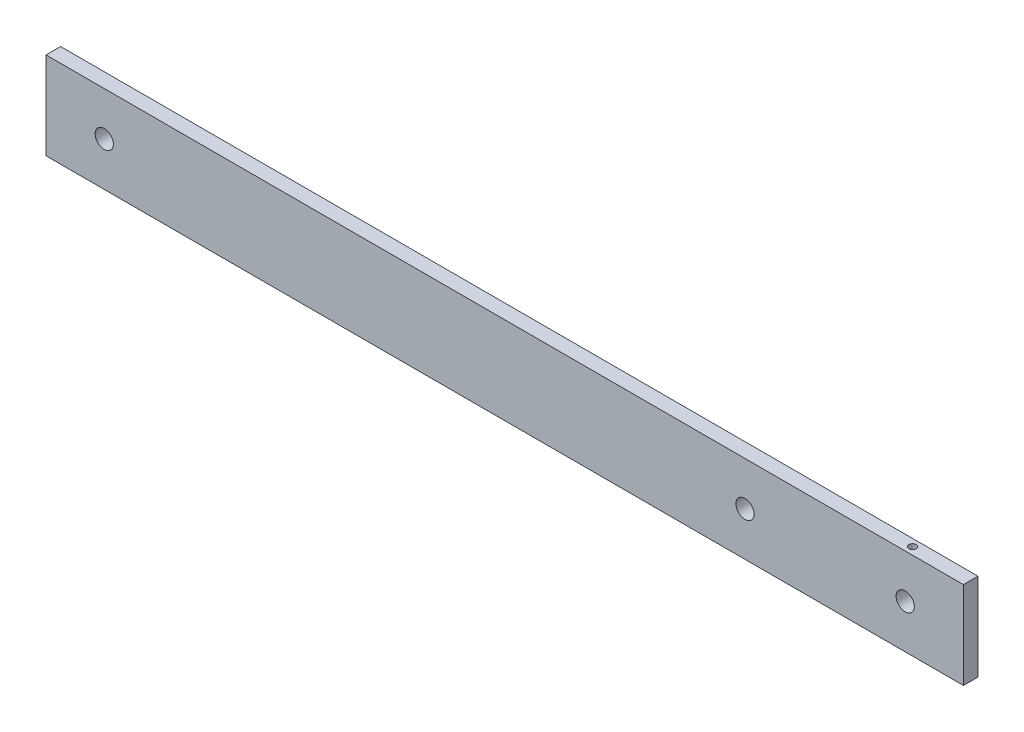
ISO-10303-21;
HEADER;
FILE_DESCRIPTION(('STEP AP214'),'2;1');
FILE_NAME('part.step','',(''),(''),'','','');
FILE_SCHEMA(('AUTOMOTIVE_DESIGN { 1 0 10303 214 1 1 1 1 }'));
ENDSEC;
DATA;
#1=APPLICATION_CONTEXT('core data for automotive mechanical design processes');
#2=APPLICATION_PROTOCOL_DEFINITION('international standard','automotive_design',2000,#1);
#3=PRODUCT_CONTEXT('',#1,'mechanical');
#4=PRODUCT('Part','Part','',(#3));
#5=PRODUCT_RELATED_PRODUCT_CATEGORY('part','',(#4));
#6=PRODUCT_DEFINITION_FORMATION('','',#4);
#7=PRODUCT_DEFINITION_CONTEXT('part definition',#1,'design');
#8=PRODUCT_DEFINITION('design','',#6,#7);
#9=PRODUCT_DEFINITION_SHAPE('','',#8);
#10=(LENGTH_UNIT() NAMED_UNIT(*) SI_UNIT(.MILLI.,.METRE.));
#11=(NAMED_UNIT(*) PLANE_ANGLE_UNIT() SI_UNIT($,.RADIAN.));
#12=(NAMED_UNIT(*) SI_UNIT($,.STERADIAN.) SOLID_ANGLE_UNIT());
#13=UNCERTAINTY_MEASURE_WITH_UNIT(LENGTH_MEASURE(1.E-05),#10,'distance_accuracy_value','');
#14=(GEOMETRIC_REPRESENTATION_CONTEXT(3) GLOBAL_UNCERTAINTY_ASSIGNED_CONTEXT((#13)) GLOBAL_UNIT_ASSIGNED_CONTEXT((#10,
#11,#12)) REPRESENTATION_CONTEXT('',''));
#15=CARTESIAN_POINT('',(0.,0.,0.));
#16=DIRECTION('',(0.,0.,1.));
#17=DIRECTION('',(1.,0.,0.));
#18=AXIS2_PLACEMENT_3D('',#15,#16,#17);
#19=CARTESIAN_POINT('',(139.7,0.,0.));
#20=DIRECTION('',(0.,0.,1.));
#21=DIRECTION('',(1.,0.,0.));
#22=AXIS2_PLACEMENT_3D('',#19,#20,#21);
#23=CYLINDRICAL_SURFACE('',#22,7.9375000000001);
#24=CARTESIAN_POINT('',(139.7,0.,12.7));
#25=DIRECTION('',(0.,0.,1.));
#26=DIRECTION('',(1.,0.,0.));
#27=AXIS2_PLACEMENT_3D('',#24,#25,#26);
#28=CIRCLE('',#27,7.9375000000001);
#29=CARTESIAN_POINT('',(147.6375,0.,12.7));
#30=VERTEX_POINT('',#29);
#31=EDGE_CURVE('E112',#30,#30,#28,.T.);
#32=ORIENTED_EDGE('',*,*,#31,.T.);
#33=EDGE_LOOP('',(#32));
#34=FACE_BOUND('',#33,.T.);
#35=CARTESIAN_POINT('',(139.7,0.,0.));
#36=DIRECTION('',(0.,0.,1.));
#37=DIRECTION('',(1.,0.,0.));
#38=AXIS2_PLACEMENT_3D('',#35,#36,#37);
#39=CIRCLE('',#38,7.9375000000001);
#40=CARTESIAN_POINT('',(147.6375,0.,0.));
#41=VERTEX_POINT('',#40);
#42=EDGE_CURVE('E134',#41,#41,#39,.T.);
#43=ORIENTED_EDGE('',*,*,#42,.F.);
#44=EDGE_LOOP('',(#43));
#45=FACE_BOUND('',#44,.T.);
#46=CARTESIAN_POINT('',(139.7,7.9375000000001,3.03736263574412));
#47=CARTESIAN_POINT('',(139.785368554328,7.9374988249376,3.03736434069488));
#48=CARTESIAN_POINT('',(139.870766754286,7.936117488055,3.04081268019446));
#49=CARTESIAN_POINT('',(140.040937950036,7.93063338703499,3.05456362637478));
#50=CARTESIAN_POINT('',(140.125710517197,7.92652890576481,3.06487055788917));
#51=CARTESIAN_POINT('',(140.378494093296,7.91024405172611,3.10601792570212));
#52=CARTESIAN_POINT('',(140.544717304002,7.89409269398449,3.14708461122902));
#53=CARTESIAN_POINT('',(140.866781108774,7.852954609094,3.25465352684399));
#54=CARTESIAN_POINT('',(141.022653752887,7.82799682735581,3.32107248555106));
#55=CARTESIAN_POINT('',(141.320940554211,7.77171078395482,3.47713054197305));
#56=CARTESIAN_POINT('',(141.463359359858,7.74038473447002,3.56676157934207));
#57=CARTESIAN_POINT('',(141.737561040363,7.67287793547003,3.77116149866413));
#58=CARTESIAN_POINT('',(141.868624714083,7.63654649529094,3.88684445492895));
#59=CARTESIAN_POINT('',(142.110101963268,7.56381162683058,4.13813513885896));
#60=CARTESIAN_POINT('',(142.220505435886,7.52740817208108,4.27375255691044));
#61=CARTESIAN_POINT('',(142.422363620188,7.45684932878633,4.56839219794035));
#62=CARTESIAN_POINT('',(142.512756348074,7.42286609334565,4.72818743249016));
#63=CARTESIAN_POINT('',(142.665060551076,7.36335914668957,5.0622766680519));
#64=CARTESIAN_POINT('',(142.726985553663,7.33783141914847,5.23656373615323));
#65=CARTESIAN_POINT('',(142.817689398504,7.29974342844111,5.58643096536958));
#66=CARTESIAN_POINT('',(142.847844175086,7.28664754820729,5.76159397224105));
#67=CARTESIAN_POINT('',(142.878449572236,7.27335356421826,6.11494569553736));
#68=CARTESIAN_POINT('',(142.878914799779,7.2731491180012,6.29313288093084));
#69=CARTESIAN_POINT('',(142.851170621952,7.28520419164098,6.63425135172435));
#70=CARTESIAN_POINT('',(142.82495456169,7.2965972775082,6.79738133248529));
#71=CARTESIAN_POINT('',(142.74791567214,7.32910947703037,7.11669718101393));
#72=CARTESIAN_POINT('',(142.697088549165,7.35023028776921,7.27288183189448));
#73=CARTESIAN_POINT('',(142.571302888018,7.40028182612313,7.57764095066968));
#74=CARTESIAN_POINT('',(142.495873031451,7.42936314617463,7.72599505273395));
#75=CARTESIAN_POINT('',(142.323354006387,7.49201759759749,8.00848524422785));
#76=CARTESIAN_POINT('',(142.226256703091,7.52559241410202,8.14261596567387));
#77=CARTESIAN_POINT('',(142.004336576641,7.59661194581113,8.40376308021456));
#78=CARTESIAN_POINT('',(141.877950722468,7.63415518150386,8.52942799373905));
#79=CARTESIAN_POINT('',(141.605499153543,7.70667472120544,8.75821174457328));
#80=CARTESIAN_POINT('',(141.459429528718,7.74165051306762,8.86132609163332));
#81=CARTESIAN_POINT('',(141.147923273512,7.80597056507682,9.0438553335167));
#82=CARTESIAN_POINT('',(140.982161030013,7.83518991276534,9.12276175714454));
#83=CARTESIAN_POINT('',(140.638250227704,7.8837603997186,9.25110411520576));
#84=CARTESIAN_POINT('',(140.460108012499,7.90311655121527,9.30055502036669));
#85=CARTESIAN_POINT('',(140.107822221577,7.92886621467243,9.36584930472306));
#86=CARTESIAN_POINT('',(139.934066229202,7.93595926510717,9.38350890687182));
#87=CARTESIAN_POINT('',(139.58594557068,7.93858709635633,9.39008218283347));
#88=CARTESIAN_POINT('',(139.411581074007,7.93412487311897,9.37900330770094));
#89=CARTESIAN_POINT('',(139.075425526644,7.91460137713718,9.32974947856803));
#90=CARTESIAN_POINT('',(138.913421544306,7.90002533761026,9.2928143419372));
#91=CARTESIAN_POINT('',(138.598060007954,7.86224363231242,9.19458344880238));
#92=CARTESIAN_POINT('',(138.444703567519,7.83903685803509,9.13328456301996));
#93=CARTESIAN_POINT('',(138.145712427515,7.78536344198664,8.98606654400266));
#94=CARTESIAN_POINT('',(138.000457388872,7.75469645367917,8.89945169887694));
#95=CARTESIAN_POINT('',(137.726033298899,7.68942716533559,8.70483237154293));
#96=CARTESIAN_POINT('',(137.596870727805,7.65482329062676,8.59681931760034));
#97=CARTESIAN_POINT('',(137.349352169178,7.5826162425039,8.35410649019131));
#98=CARTESIAN_POINT('',(137.232272630029,7.54496588261813,8.21811563862075));
#99=CARTESIAN_POINT('',(137.022282474159,7.4730240575642,7.92775150394929));
#100=CARTESIAN_POINT('',(136.929375840326,7.43873314650081,7.77337519763877));
#101=CARTESIAN_POINT('',(136.769780590482,7.3773395110174,7.44829219564256));
#102=CARTESIAN_POINT('',(136.703354680422,7.3503096402303,7.27744178724386));
#103=CARTESIAN_POINT('',(136.600729751971,7.30763831652796,6.92557296339745));
#104=CARTESIAN_POINT('',(136.564508424446,7.29198845941935,6.74456215808783));
#105=CARTESIAN_POINT('',(136.525451454961,7.27506417865874,6.39154709253945));
#106=CARTESIAN_POINT('',(136.520400872432,7.27283630768354,6.2198320810005));
#107=CARTESIAN_POINT('',(136.538012494058,7.28051052284664,5.87812267101404));
#108=CARTESIAN_POINT('',(136.560671179219,7.29041106871293,5.70812805684546));
#109=CARTESIAN_POINT('',(136.631249172583,7.32038555119364,5.38157279546985));
#110=CARTESIAN_POINT('',(136.678134105709,7.34004169450697,5.22474674081521));
#111=CARTESIAN_POINT('',(136.794866473802,7.38701853032595,4.92112402048813));
#112=CARTESIAN_POINT('',(136.864720250315,7.41434133924117,4.77433013816625));
#113=CARTESIAN_POINT('',(137.03002650328,7.47551538507988,4.48578252572208));
#114=CARTESIAN_POINT('',(137.126715669248,7.50965084432635,4.34479861203644));
#115=CARTESIAN_POINT('',(137.341148122404,7.5797380568548,4.08036012937314));
#116=CARTESIAN_POINT('',(137.458897755458,7.61569035523133,3.95691086404597));
#117=CARTESIAN_POINT('',(137.721165095428,7.68815973066461,3.72284305631513));
#118=CARTESIAN_POINT('',(137.866923344415,7.72456229557393,3.61357533157662));
#119=CARTESIAN_POINT('',(138.176186758541,7.79145894481055,3.42099315567663));
#120=CARTESIAN_POINT('',(138.339700129485,7.8219502788822,3.33769077423214));
#121=CARTESIAN_POINT('',(138.593099260072,7.86039859512774,3.23519318063684));
#122=CARTESIAN_POINT('',(138.678125570204,7.87192833758894,3.20494340069624));
#123=CARTESIAN_POINT('',(138.850717117252,7.89241101848926,3.15172861404931));
#124=CARTESIAN_POINT('',(138.938281149421,7.90136515829445,3.12876021050008));
#125=CARTESIAN_POINT('',(139.11505117003,7.91641316871209,3.09040415297413));
#126=CARTESIAN_POINT('',(139.204252390751,7.92251429007154,3.07499727690651));
#127=CARTESIAN_POINT('',(139.38375453887,7.93170572455027,3.05185793653977));
#128=CARTESIAN_POINT('',(139.474054638337,7.93479817758859,3.04412001761217));
#129=CARTESIAN_POINT('',(139.609646902844,7.93711466317082,3.03832622664855));
#130=CARTESIAN_POINT('',(139.654819299581,7.93750062189357,3.03736173341105));
#131=CARTESIAN_POINT('',(139.7,7.9375000000001,3.03736263574412));
#132=B_SPLINE_CURVE_WITH_KNOTS('',3,(#46,#47,#48,#49,#50,#51,#52,#53,#54,#55,#56,#57,#58,#59,
#60,#61,#62,#63,#64,#65,#66,#67,#68,#69,#70,#71,#72,#73,#74,#75,#76,#77,#78,#79,#80,#81,#82,#83,
#84,#85,#86,#87,#88,#89,#90,#91,#92,#93,#94,#95,#96,#97,#98,#99,#100,#101,#102,#103,#104,#105,
#106,#107,#108,#109,#110,#111,#112,#113,#114,#115,#116,#117,#118,#119,#120,#121,#122,#123,#124,
#125,#126,#127,#128,#129,#130,#131),.UNSPECIFIED.,.T.,.F.,(4,2,2,2,2,2,2,2,2,2,2,2,2,2,2,2,2,2,
2,2,2,2,2,2,2,2,2,2,2,2,2,2,2,2,2,2,2,2,2,2,2,2,4),(0.,0.256066919778835,0.512295461299284,
1.02550349018164,1.53704015675519,2.04839943091081,2.58171415251288,3.11528898760288,
3.67261045177418,4.22966681002162,4.76145838979679,5.2929883311744,5.78752668142723,
6.28215134077773,6.78687059808169,7.29177966635667,7.83571951142462,8.37976756691879,
8.9345642145476,9.4890786463945,10.0107665224702,10.5323191535131,11.0304379501724,
11.5286207458647,12.0420414932856,12.5556683251343,13.1032052527507,13.6508323391577,
14.2037645596988,14.7562880213424,15.2690505331981,15.7817479325266,16.27417052505,
16.7667291864952,17.2874900234882,17.808408039494,18.3630999416879,18.9180493033818,
19.190692753087,19.4632088237855,19.7350284985658,20.0066546996239,20.1421762963166),.UNSPECIFIED.);
#133=CARTESIAN_POINT('',(139.7,7.9375000000001,3.03736263574412));
#134=VERTEX_POINT('',#133);
#135=EDGE_CURVE('E43',#134,#134,#132,.T.);
#136=ORIENTED_EDGE('',*,*,#135,.F.);
#137=EDGE_LOOP('',(#136));
#138=FACE_BOUND('',#137,.T.);
#139=ADVANCED_FACE('F39',(#34,#45,#138),#23,.F.);
#140=CARTESIAN_POINT('',(-609.6,38.1,12.7));
#141=DIRECTION('',(1.,0.,0.));
#142=DIRECTION('',(0.,0.,-1.));
#143=AXIS2_PLACEMENT_3D('',#140,#141,#142);
#144=PLANE('',#143);
#145=DIRECTION('',(0.,-1.,0.));
#146=VECTOR('',#145,1.);
#147=CARTESIAN_POINT('',(-609.6,38.1,0.));
#148=LINE('',#147,#146);
#149=CARTESIAN_POINT('',(-609.6,38.1,0.));
#150=VERTEX_POINT('',#149);
#151=CARTESIAN_POINT('',(-609.6,-38.1,0.));
#152=VERTEX_POINT('',#151);
#153=EDGE_CURVE('E110',#150,#152,#148,.T.);
#154=ORIENTED_EDGE('',*,*,#153,.T.);
#155=DIRECTION('',(0.,0.,-1.));
#156=VECTOR('',#155,1.);
#157=CARTESIAN_POINT('',(-609.6,-38.1,12.7));
#158=LINE('',#157,#156);
#159=CARTESIAN_POINT('',(-609.6,-38.1,12.7));
#160=VERTEX_POINT('',#159);
#161=EDGE_CURVE('E11',#160,#152,#158,.T.);
#162=ORIENTED_EDGE('',*,*,#161,.F.);
#163=DIRECTION('',(0.,-1.,0.));
#164=VECTOR('',#163,1.);
#165=CARTESIAN_POINT('',(-609.6,38.1,12.7));
#166=LINE('',#165,#164);
#167=CARTESIAN_POINT('',(-609.6,38.1,12.7));
#168=VERTEX_POINT('',#167);
#169=EDGE_CURVE('E95',#168,#160,#166,.T.);
#170=ORIENTED_EDGE('',*,*,#169,.F.);
#171=DIRECTION('',(0.,0.,-1.));
#172=VECTOR('',#171,1.);
#173=CARTESIAN_POINT('',(-609.6,38.1,12.7));
#174=LINE('',#173,#172);
#175=EDGE_CURVE('E62',#168,#150,#174,.T.);
#176=ORIENTED_EDGE('',*,*,#175,.T.);
#177=EDGE_LOOP('',(#154,#162,#170,#176));
#178=FACE_BOUND('',#177,.T.);
#179=ADVANCED_FACE('F41',(#178),#144,.F.);
#180=CARTESIAN_POINT('',(-609.6,-38.1,12.7));
#181=DIRECTION('',(0.,1.,0.));
#182=DIRECTION('',(-1.,0.,0.));
#183=AXIS2_PLACEMENT_3D('',#180,#181,#182);
#184=PLANE('',#183);
#185=DIRECTION('',(1.,0.,0.));
#186=VECTOR('',#185,1.);
#187=CARTESIAN_POINT('',(-609.6,-38.1,0.));
#188=LINE('',#187,#186);
#189=CARTESIAN_POINT('',(190.5,-38.1,0.));
#190=VERTEX_POINT('',#189);
#191=EDGE_CURVE('E100',#152,#190,#188,.T.);
#192=ORIENTED_EDGE('',*,*,#191,.T.);
#193=DIRECTION('',(0.,0.,-1.));
#194=VECTOR('',#193,1.);
#195=CARTESIAN_POINT('',(190.5,-38.1,12.7));
#196=LINE('',#195,#194);
#197=CARTESIAN_POINT('',(190.5,-38.1,12.7));
#198=VERTEX_POINT('',#197);
#199=EDGE_CURVE('E54',#198,#190,#196,.T.);
#200=ORIENTED_EDGE('',*,*,#199,.F.);
#201=DIRECTION('',(1.,0.,0.));
#202=VECTOR('',#201,1.);
#203=CARTESIAN_POINT('',(-609.6,-38.1,12.7));
#204=LINE('',#203,#202);
#205=EDGE_CURVE('E87',#160,#198,#204,.T.);
#206=ORIENTED_EDGE('',*,*,#205,.F.);
#207=ORIENTED_EDGE('',*,*,#161,.T.);
#208=EDGE_LOOP('',(#192,#200,#206,#207));
#209=FACE_BOUND('',#208,.T.);
#210=ADVANCED_FACE('F99',(#209),#184,.F.);
#211=CARTESIAN_POINT('',(190.5,38.1,12.7));
#212=DIRECTION('',(1.,0.,0.));
#213=DIRECTION('',(0.,0.,-1.));
#214=AXIS2_PLACEMENT_3D('',#211,#212,#213);
#215=PLANE('',#214);
#216=DIRECTION('',(0.,-1.,0.));
#217=VECTOR('',#216,1.);
#218=CARTESIAN_POINT('',(190.5,38.1,0.));
#219=LINE('',#218,#217);
#220=CARTESIAN_POINT('',(190.5,38.1,0.));
#221=VERTEX_POINT('',#220);
#222=EDGE_CURVE('E114',#221,#190,#219,.T.);
#223=ORIENTED_EDGE('',*,*,#222,.F.);
#224=DIRECTION('',(0.,0.,-1.));
#225=VECTOR('',#224,1.);
#226=CARTESIAN_POINT('',(190.5,38.1,12.7));
#227=LINE('',#226,#225);
#228=CARTESIAN_POINT('',(190.5,38.1,12.7));
#229=VERTEX_POINT('',#228);
#230=EDGE_CURVE('E76',#229,#221,#227,.T.);
#231=ORIENTED_EDGE('',*,*,#230,.F.);
#232=DIRECTION('',(0.,-1.,0.));
#233=VECTOR('',#232,1.);
#234=CARTESIAN_POINT('',(190.5,38.1,12.7));
#235=LINE('',#234,#233);
#236=EDGE_CURVE('E94',#229,#198,#235,.T.);
#237=ORIENTED_EDGE('',*,*,#236,.T.);
#238=ORIENTED_EDGE('',*,*,#199,.T.);
#239=EDGE_LOOP('',(#223,#231,#237,#238));
#240=FACE_BOUND('',#239,.T.);
#241=ADVANCED_FACE('F104',(#240),#215,.T.);
#242=CARTESIAN_POINT('',(-609.6,38.1,12.7));
#243=DIRECTION('',(0.,1.,0.));
#244=DIRECTION('',(-1.,0.,0.));
#245=AXIS2_PLACEMENT_3D('',#242,#243,#244);
#246=PLANE('',#245);
#247=CARTESIAN_POINT('',(139.7,38.1,6.21236263574421));
#248=DIRECTION('',(0.,1.,0.));
#249=DIRECTION('',(-1.,0.,0.));
#250=AXIS2_PLACEMENT_3D('',#247,#248,#249);
#251=CIRCLE('',#250,3.17500000000009);
#252=CARTESIAN_POINT('',(136.525,38.1,6.21236263574421));
#253=VERTEX_POINT('',#252);
#254=EDGE_CURVE('E137',#253,#253,#251,.F.);
#255=ORIENTED_EDGE('',*,*,#254,.T.);
#256=EDGE_LOOP('',(#255));
#257=FACE_BOUND('',#256,.T.);
#258=DIRECTION('',(1.,0.,0.));
#259=VECTOR('',#258,1.);
#260=CARTESIAN_POINT('',(-609.6,38.1,0.));
#261=LINE('',#260,#259);
#262=EDGE_CURVE('E116',#150,#221,#261,.T.);
#263=ORIENTED_EDGE('',*,*,#262,.F.);
#264=ORIENTED_EDGE('',*,*,#175,.F.);
#265=DIRECTION('',(1.,0.,0.));
#266=VECTOR('',#265,1.);
#267=CARTESIAN_POINT('',(-609.6,38.1,12.7));
#268=LINE('',#267,#266);
#269=EDGE_CURVE('E105',#168,#229,#268,.T.);
#270=ORIENTED_EDGE('',*,*,#269,.T.);
#271=ORIENTED_EDGE('',*,*,#230,.T.);
#272=EDGE_LOOP('',(#263,#264,#270,#271));
#273=FACE_BOUND('',#272,.T.);
#274=ADVANCED_FACE('F167',(#257,#273),#246,.T.);
#275=CARTESIAN_POINT('',(0.,0.,12.7));
#276=DIRECTION('',(0.,0.,1.));
#277=DIRECTION('',(1.,0.,0.));
#278=AXIS2_PLACEMENT_3D('',#275,#276,#277);
#279=PLANE('',#278);
#280=ORIENTED_EDGE('',*,*,#31,.F.);
#281=EDGE_LOOP('',(#280));
#282=FACE_BOUND('',#281,.T.);
#283=CARTESIAN_POINT('',(-558.8,0.,12.7));
#284=DIRECTION('',(0.,0.,1.));
#285=DIRECTION('',(1.,0.,0.));
#286=AXIS2_PLACEMENT_3D('',#283,#284,#285);
#287=CIRCLE('',#286,7.93750000000009);
#288=CARTESIAN_POINT('',(-550.8625,0.,12.7));
#289=VERTEX_POINT('',#288);
#290=EDGE_CURVE('E124',#289,#289,#287,.T.);
#291=ORIENTED_EDGE('',*,*,#290,.F.);
#292=EDGE_LOOP('',(#291));
#293=FACE_BOUND('',#292,.T.);
#294=CARTESIAN_POINT('',(0.,0.,12.7));
#295=DIRECTION('',(0.,0.,1.));
#296=DIRECTION('',(1.,0.,0.));
#297=AXIS2_PLACEMENT_3D('',#294,#295,#296);
#298=CIRCLE('',#297,7.9375);
#299=CARTESIAN_POINT('',(7.9375,0.,12.7));
#300=VERTEX_POINT('',#299);
#301=EDGE_CURVE('E127',#300,#300,#298,.T.);
#302=ORIENTED_EDGE('',*,*,#301,.F.);
#303=EDGE_LOOP('',(#302));
#304=FACE_BOUND('',#303,.T.);
#305=ORIENTED_EDGE('',*,*,#169,.T.);
#306=ORIENTED_EDGE('',*,*,#205,.T.);
#307=ORIENTED_EDGE('',*,*,#236,.F.);
#308=ORIENTED_EDGE('',*,*,#269,.F.);
#309=EDGE_LOOP('',(#305,#306,#307,#308));
#310=FACE_BOUND('',#309,.T.);
#311=ADVANCED_FACE('F91',(#282,#293,#304,#310),#279,.T.);
#312=CARTESIAN_POINT('',(0.,0.,0.));
#313=DIRECTION('',(0.,0.,1.));
#314=DIRECTION('',(1.,0.,0.));
#315=AXIS2_PLACEMENT_3D('',#312,#313,#314);
#316=PLANE('',#315);
#317=ORIENTED_EDGE('',*,*,#42,.T.);
#318=EDGE_LOOP('',(#317));
#319=FACE_BOUND('',#318,.T.);
#320=CARTESIAN_POINT('',(-558.8,0.,0.));
#321=DIRECTION('',(0.,0.,1.));
#322=DIRECTION('',(1.,0.,0.));
#323=AXIS2_PLACEMENT_3D('',#320,#321,#322);
#324=CIRCLE('',#323,7.93750000000009);
#325=CARTESIAN_POINT('',(-550.8625,0.,0.));
#326=VERTEX_POINT('',#325);
#327=EDGE_CURVE('E133',#326,#326,#324,.T.);
#328=ORIENTED_EDGE('',*,*,#327,.T.);
#329=EDGE_LOOP('',(#328));
#330=FACE_BOUND('',#329,.T.);
#331=CARTESIAN_POINT('',(0.,0.,0.));
#332=DIRECTION('',(0.,0.,1.));
#333=DIRECTION('',(1.,0.,0.));
#334=AXIS2_PLACEMENT_3D('',#331,#332,#333);
#335=CIRCLE('',#334,7.9375);
#336=CARTESIAN_POINT('',(7.9375,0.,0.));
#337=VERTEX_POINT('',#336);
#338=EDGE_CURVE('E130',#337,#337,#335,.T.);
#339=ORIENTED_EDGE('',*,*,#338,.T.);
#340=EDGE_LOOP('',(#339));
#341=FACE_BOUND('',#340,.T.);
#342=ORIENTED_EDGE('',*,*,#153,.F.);
#343=ORIENTED_EDGE('',*,*,#262,.T.);
#344=ORIENTED_EDGE('',*,*,#222,.T.);
#345=ORIENTED_EDGE('',*,*,#191,.F.);
#346=EDGE_LOOP('',(#342,#343,#344,#345));
#347=FACE_BOUND('',#346,.T.);
#348=ADVANCED_FACE('F163',(#319,#330,#341,#347),#316,.F.);
#349=CARTESIAN_POINT('',(0.,0.,0.));
#350=DIRECTION('',(0.,0.,1.));
#351=DIRECTION('',(1.,0.,0.));
#352=AXIS2_PLACEMENT_3D('',#349,#350,#351);
#353=CYLINDRICAL_SURFACE('',#352,7.9375);
#354=ORIENTED_EDGE('',*,*,#301,.T.);
#355=EDGE_LOOP('',(#354));
#356=FACE_BOUND('',#355,.T.);
#357=ORIENTED_EDGE('',*,*,#338,.F.);
#358=EDGE_LOOP('',(#357));
#359=FACE_BOUND('',#358,.T.);
#360=ADVANCED_FACE('F160',(#356,#359),#353,.F.);
#361=CARTESIAN_POINT('',(-558.8,0.,0.));
#362=DIRECTION('',(0.,0.,1.));
#363=DIRECTION('',(1.,0.,0.));
#364=AXIS2_PLACEMENT_3D('',#361,#362,#363);
#365=CYLINDRICAL_SURFACE('',#364,7.93750000000009);
#366=ORIENTED_EDGE('',*,*,#290,.T.);
#367=EDGE_LOOP('',(#366));
#368=FACE_BOUND('',#367,.T.);
#369=ORIENTED_EDGE('',*,*,#327,.F.);
#370=EDGE_LOOP('',(#369));
#371=FACE_BOUND('',#370,.T.);
#372=ADVANCED_FACE('F159',(#368,#371),#365,.F.);
#373=CARTESIAN_POINT('',(139.7,38.100012,6.21236263574421));
#374=DIRECTION('',(0.,-1.,0.));
#375=DIRECTION('',(0.,0.,-1.));
#376=AXIS2_PLACEMENT_3D('',#373,#374,#375);
#377=CYLINDRICAL_SURFACE('',#376,3.17500000000009);
#378=ORIENTED_EDGE('',*,*,#254,.F.);
#379=EDGE_LOOP('',(#378));
#380=FACE_BOUND('',#379,.T.);
#381=ORIENTED_EDGE('',*,*,#135,.T.);
#382=EDGE_LOOP('',(#381));
#383=FACE_BOUND('',#382,.T.);
#384=ADVANCED_FACE('F146',(#380,#383),#377,.F.);
#385=CLOSED_SHELL('',(#139,#179,#210,#241,#274,#311,#348,#360,#372,#384));
#386=MANIFOLD_SOLID_BREP('B2',#385);
#387=ADVANCED_BREP_SHAPE_REPRESENTATION('',(#18,#386),#14);
#388=SHAPE_DEFINITION_REPRESENTATION(#9,#387);
ENDSEC;
END-ISO-10303-21;
